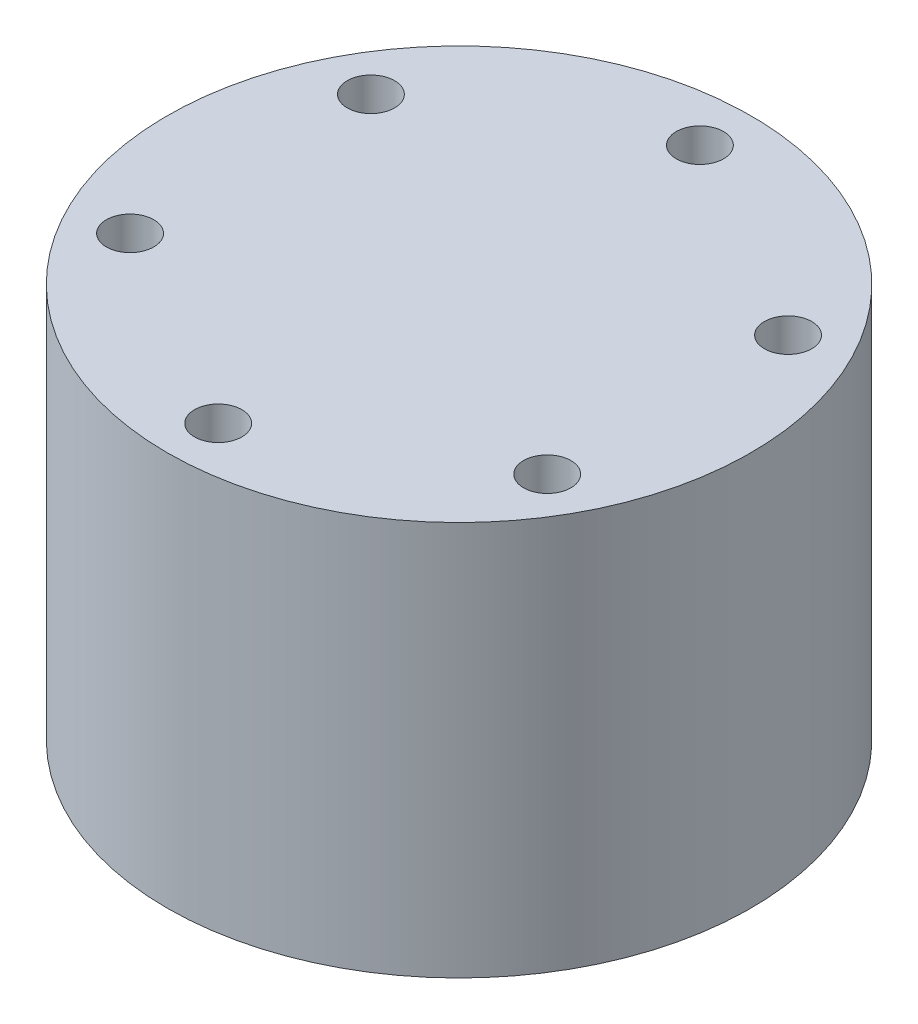
ISO-10303-21;
HEADER;
FILE_DESCRIPTION(('STEP AP214'),'2;1');
FILE_NAME('part.step','',(''),(''),'','','');
FILE_SCHEMA(('AUTOMOTIVE_DESIGN { 1 0 10303 214 1 1 1 1 }'));
ENDSEC;
DATA;
#1=APPLICATION_CONTEXT('core data for automotive mechanical design processes');
#2=APPLICATION_PROTOCOL_DEFINITION('international standard','automotive_design',2000,#1);
#3=PRODUCT_CONTEXT('',#1,'mechanical');
#4=PRODUCT('Part','Part','',(#3));
#5=PRODUCT_RELATED_PRODUCT_CATEGORY('part','',(#4));
#6=PRODUCT_DEFINITION_FORMATION('','',#4);
#7=PRODUCT_DEFINITION_CONTEXT('part definition',#1,'design');
#8=PRODUCT_DEFINITION('design','',#6,#7);
#9=PRODUCT_DEFINITION_SHAPE('','',#8);
#10=(LENGTH_UNIT() NAMED_UNIT(*) SI_UNIT(.MILLI.,.METRE.));
#11=(NAMED_UNIT(*) PLANE_ANGLE_UNIT() SI_UNIT($,.RADIAN.));
#12=(NAMED_UNIT(*) SI_UNIT($,.STERADIAN.) SOLID_ANGLE_UNIT());
#13=UNCERTAINTY_MEASURE_WITH_UNIT(LENGTH_MEASURE(1.E-05),#10,'distance_accuracy_value','');
#14=(GEOMETRIC_REPRESENTATION_CONTEXT(3) GLOBAL_UNCERTAINTY_ASSIGNED_CONTEXT((#13)) GLOBAL_UNIT_ASSIGNED_CONTEXT((#10,
#11,#12)) REPRESENTATION_CONTEXT('',''));
#15=CARTESIAN_POINT('',(0.,0.,0.));
#16=DIRECTION('',(0.,0.,1.));
#17=DIRECTION('',(1.,0.,0.));
#18=AXIS2_PLACEMENT_3D('',#15,#16,#17);
#19=CARTESIAN_POINT('',(0.,25.,0.));
#20=DIRECTION('',(0.,-1.,0.));
#21=DIRECTION('',(0.,0.,-1.));
#22=AXIS2_PLACEMENT_3D('',#19,#20,#21);
#23=CYLINDRICAL_SURFACE('',#22,18.5);
#24=CARTESIAN_POINT('',(0.,25.,0.));
#25=DIRECTION('',(0.,1.,0.));
#26=DIRECTION('',(0.,0.,1.));
#27=AXIS2_PLACEMENT_3D('',#24,#25,#26);
#28=CIRCLE('',#27,18.5);
#29=CARTESIAN_POINT('',(0.,25.,18.5));
#30=VERTEX_POINT('',#29);
#31=EDGE_CURVE('E10',#30,#30,#28,.T.);
#32=ORIENTED_EDGE('',*,*,#31,.F.);
#33=EDGE_LOOP('',(#32));
#34=FACE_BOUND('',#33,.T.);
#35=CARTESIAN_POINT('',(0.,0.,0.));
#36=DIRECTION('',(0.,1.,0.));
#37=DIRECTION('',(0.,0.,1.));
#38=AXIS2_PLACEMENT_3D('',#35,#36,#37);
#39=CIRCLE('',#38,18.5);
#40=CARTESIAN_POINT('',(0.,0.,18.5));
#41=VERTEX_POINT('',#40);
#42=EDGE_CURVE('E46',#41,#41,#39,.T.);
#43=ORIENTED_EDGE('',*,*,#42,.T.);
#44=EDGE_LOOP('',(#43));
#45=FACE_BOUND('',#44,.T.);
#46=ADVANCED_FACE('F43',(#34,#45),#23,.T.);
#47=CARTESIAN_POINT('',(0.,25.,0.));
#48=DIRECTION('',(0.,1.,0.));
#49=DIRECTION('',(0.,0.,1.));
#50=AXIS2_PLACEMENT_3D('',#47,#48,#49);
#51=PLANE('',#50);
#52=CARTESIAN_POINT('',(-13.2198777887695,25.,7.63250000000001));
#53=DIRECTION('',(0.,1.,0.));
#54=DIRECTION('',(0.,0.,1.));
#55=AXIS2_PLACEMENT_3D('',#52,#53,#54);
#56=CIRCLE('',#55,1.5);
#57=CARTESIAN_POINT('',(-13.2198777887695,25.,9.13250000000001));
#58=VERTEX_POINT('',#57);
#59=EDGE_CURVE('E62',#58,#58,#56,.T.);
#60=ORIENTED_EDGE('',*,*,#59,.F.);
#61=EDGE_LOOP('',(#60));
#62=FACE_BOUND('',#61,.T.);
#63=CARTESIAN_POINT('',(0.,25.,15.265));
#64=DIRECTION('',(0.,1.,0.));
#65=DIRECTION('',(0.,0.,1.));
#66=AXIS2_PLACEMENT_3D('',#63,#64,#65);
#67=CIRCLE('',#66,1.5);
#68=CARTESIAN_POINT('',(0.,25.,16.765));
#69=VERTEX_POINT('',#68);
#70=EDGE_CURVE('E70',#69,#69,#67,.T.);
#71=ORIENTED_EDGE('',*,*,#70,.F.);
#72=EDGE_LOOP('',(#71));
#73=FACE_BOUND('',#72,.T.);
#74=CARTESIAN_POINT('',(13.2198777887695,25.,7.6325));
#75=DIRECTION('',(0.,1.,0.));
#76=DIRECTION('',(0.,0.,1.));
#77=AXIS2_PLACEMENT_3D('',#74,#75,#76);
#78=CIRCLE('',#77,1.5);
#79=CARTESIAN_POINT('',(13.2198777887695,25.,9.1325));
#80=VERTEX_POINT('',#79);
#81=EDGE_CURVE('E71',#80,#80,#78,.T.);
#82=ORIENTED_EDGE('',*,*,#81,.F.);
#83=EDGE_LOOP('',(#82));
#84=FACE_BOUND('',#83,.T.);
#85=CARTESIAN_POINT('',(13.2198777887695,25.,-7.6325));
#86=DIRECTION('',(0.,1.,0.));
#87=DIRECTION('',(0.,0.,1.));
#88=AXIS2_PLACEMENT_3D('',#85,#86,#87);
#89=CIRCLE('',#88,1.5);
#90=CARTESIAN_POINT('',(13.2198777887695,25.,-6.1325));
#91=VERTEX_POINT('',#90);
#92=EDGE_CURVE('E76',#91,#91,#89,.T.);
#93=ORIENTED_EDGE('',*,*,#92,.F.);
#94=EDGE_LOOP('',(#93));
#95=FACE_BOUND('',#94,.T.);
#96=CARTESIAN_POINT('',(0.,25.,-15.265));
#97=DIRECTION('',(0.,1.,0.));
#98=DIRECTION('',(0.,0.,1.));
#99=AXIS2_PLACEMENT_3D('',#96,#97,#98);
#100=CIRCLE('',#99,1.5);
#101=CARTESIAN_POINT('',(0.,25.,-13.765));
#102=VERTEX_POINT('',#101);
#103=EDGE_CURVE('E84',#102,#102,#100,.T.);
#104=ORIENTED_EDGE('',*,*,#103,.F.);
#105=EDGE_LOOP('',(#104));
#106=FACE_BOUND('',#105,.T.);
#107=CARTESIAN_POINT('',(-13.2198777887695,25.,-7.6325));
#108=DIRECTION('',(0.,1.,0.));
#109=DIRECTION('',(0.,0.,1.));
#110=AXIS2_PLACEMENT_3D('',#107,#108,#109);
#111=CIRCLE('',#110,1.5);
#112=CARTESIAN_POINT('',(-13.2198777887695,25.,-6.1325));
#113=VERTEX_POINT('',#112);
#114=EDGE_CURVE('E54',#113,#113,#111,.T.);
#115=ORIENTED_EDGE('',*,*,#114,.F.);
#116=EDGE_LOOP('',(#115));
#117=FACE_BOUND('',#116,.T.);
#118=ORIENTED_EDGE('',*,*,#31,.T.);
#119=EDGE_LOOP('',(#118));
#120=FACE_BOUND('',#119,.T.);
#121=ADVANCED_FACE('F99',(#62,#73,#84,#95,#106,#117,#120),#51,.T.);
#122=CARTESIAN_POINT('',(0.,0.,0.));
#123=DIRECTION('',(0.,1.,0.));
#124=DIRECTION('',(0.,0.,1.));
#125=AXIS2_PLACEMENT_3D('',#122,#123,#124);
#126=PLANE('',#125);
#127=ORIENTED_EDGE('',*,*,#42,.F.);
#128=EDGE_LOOP('',(#127));
#129=FACE_BOUND('',#128,.T.);
#130=ADVANCED_FACE('F103',(#129),#126,.F.);
#131=CARTESIAN_POINT('',(-13.2198777887695,15.,-7.6325));
#132=DIRECTION('',(0.,1.,0.));
#133=DIRECTION('',(0.,0.,1.));
#134=AXIS2_PLACEMENT_3D('',#131,#132,#133);
#135=CYLINDRICAL_SURFACE('',#134,1.5);
#136=CARTESIAN_POINT('',(-13.2198777887695,15.,-7.6325));
#137=DIRECTION('',(0.,1.,0.));
#138=DIRECTION('',(0.,0.,1.));
#139=AXIS2_PLACEMENT_3D('',#136,#137,#138);
#140=CIRCLE('',#139,1.5);
#141=CARTESIAN_POINT('',(-13.2198777887695,15.,-6.1325));
#142=VERTEX_POINT('',#141);
#143=EDGE_CURVE('E52',#142,#142,#140,.T.);
#144=ORIENTED_EDGE('',*,*,#143,.F.);
#145=EDGE_LOOP('',(#144));
#146=FACE_BOUND('',#145,.T.);
#147=ORIENTED_EDGE('',*,*,#114,.T.);
#148=EDGE_LOOP('',(#147));
#149=FACE_BOUND('',#148,.T.);
#150=ADVANCED_FACE('F107',(#146,#149),#135,.F.);
#151=CARTESIAN_POINT('',(0.,15.,0.));
#152=DIRECTION('',(0.,1.,0.));
#153=DIRECTION('',(0.,0.,1.));
#154=AXIS2_PLACEMENT_3D('',#151,#152,#153);
#155=PLANE('',#154);
#156=ORIENTED_EDGE('',*,*,#143,.T.);
#157=EDGE_LOOP('',(#156));
#158=FACE_BOUND('',#157,.T.);
#159=ADVANCED_FACE('F96',(#158),#155,.T.);
#160=CARTESIAN_POINT('',(0.,15.,-15.265));
#161=DIRECTION('',(0.,1.,0.));
#162=DIRECTION('',(0.,0.,1.));
#163=AXIS2_PLACEMENT_3D('',#160,#161,#162);
#164=CYLINDRICAL_SURFACE('',#163,1.5);
#165=CARTESIAN_POINT('',(0.,15.,-15.265));
#166=DIRECTION('',(0.,1.,0.));
#167=DIRECTION('',(0.,0.,1.));
#168=AXIS2_PLACEMENT_3D('',#165,#166,#167);
#169=CIRCLE('',#168,1.5);
#170=CARTESIAN_POINT('',(0.,15.,-13.765));
#171=VERTEX_POINT('',#170);
#172=EDGE_CURVE('E59',#171,#171,#169,.T.);
#173=ORIENTED_EDGE('',*,*,#172,.F.);
#174=EDGE_LOOP('',(#173));
#175=FACE_BOUND('',#174,.T.);
#176=ORIENTED_EDGE('',*,*,#103,.T.);
#177=EDGE_LOOP('',(#176));
#178=FACE_BOUND('',#177,.T.);
#179=ADVANCED_FACE('F91',(#175,#178),#164,.F.);
#180=CARTESIAN_POINT('',(0.,15.,0.));
#181=DIRECTION('',(0.,1.,0.));
#182=DIRECTION('',(0.,0.,1.));
#183=AXIS2_PLACEMENT_3D('',#180,#181,#182);
#184=PLANE('',#183);
#185=ORIENTED_EDGE('',*,*,#172,.T.);
#186=EDGE_LOOP('',(#185));
#187=FACE_BOUND('',#186,.T.);
#188=ADVANCED_FACE('F93',(#187),#184,.T.);
#189=CARTESIAN_POINT('',(13.2198777887695,15.,-7.6325));
#190=DIRECTION('',(0.,1.,0.));
#191=DIRECTION('',(0.,0.,1.));
#192=AXIS2_PLACEMENT_3D('',#189,#190,#191);
#193=CYLINDRICAL_SURFACE('',#192,1.5);
#194=CARTESIAN_POINT('',(13.2198777887695,15.,-7.6325));
#195=DIRECTION('',(0.,1.,0.));
#196=DIRECTION('',(0.,0.,1.));
#197=AXIS2_PLACEMENT_3D('',#194,#195,#196);
#198=CIRCLE('',#197,1.5);
#199=CARTESIAN_POINT('',(13.2198777887695,15.,-6.1325));
#200=VERTEX_POINT('',#199);
#201=EDGE_CURVE('E85',#200,#200,#198,.T.);
#202=ORIENTED_EDGE('',*,*,#201,.F.);
#203=EDGE_LOOP('',(#202));
#204=FACE_BOUND('',#203,.T.);
#205=ORIENTED_EDGE('',*,*,#92,.T.);
#206=EDGE_LOOP('',(#205));
#207=FACE_BOUND('',#206,.T.);
#208=ADVANCED_FACE('F165',(#204,#207),#193,.F.);
#209=CARTESIAN_POINT('',(0.,15.,0.));
#210=DIRECTION('',(0.,1.,0.));
#211=DIRECTION('',(0.,0.,1.));
#212=AXIS2_PLACEMENT_3D('',#209,#210,#211);
#213=PLANE('',#212);
#214=ORIENTED_EDGE('',*,*,#201,.T.);
#215=EDGE_LOOP('',(#214));
#216=FACE_BOUND('',#215,.T.);
#217=ADVANCED_FACE('F172',(#216),#213,.T.);
#218=CARTESIAN_POINT('',(13.2198777887695,15.,7.6325));
#219=DIRECTION('',(0.,1.,0.));
#220=DIRECTION('',(0.,0.,1.));
#221=AXIS2_PLACEMENT_3D('',#218,#219,#220);
#222=CYLINDRICAL_SURFACE('',#221,1.5);
#223=CARTESIAN_POINT('',(13.2198777887695,15.,7.6325));
#224=DIRECTION('',(0.,1.,0.));
#225=DIRECTION('',(0.,0.,1.));
#226=AXIS2_PLACEMENT_3D('',#223,#224,#225);
#227=CIRCLE('',#226,1.5);
#228=CARTESIAN_POINT('',(13.2198777887695,15.,9.1325));
#229=VERTEX_POINT('',#228);
#230=EDGE_CURVE('E77',#229,#229,#227,.T.);
#231=ORIENTED_EDGE('',*,*,#230,.F.);
#232=EDGE_LOOP('',(#231));
#233=FACE_BOUND('',#232,.T.);
#234=ORIENTED_EDGE('',*,*,#81,.T.);
#235=EDGE_LOOP('',(#234));
#236=FACE_BOUND('',#235,.T.);
#237=ADVANCED_FACE('F179',(#233,#236),#222,.F.);
#238=CARTESIAN_POINT('',(0.,15.,0.));
#239=DIRECTION('',(0.,1.,0.));
#240=DIRECTION('',(0.,0.,1.));
#241=AXIS2_PLACEMENT_3D('',#238,#239,#240);
#242=PLANE('',#241);
#243=ORIENTED_EDGE('',*,*,#230,.T.);
#244=EDGE_LOOP('',(#243));
#245=FACE_BOUND('',#244,.T.);
#246=ADVANCED_FACE('F188',(#245),#242,.T.);
#247=CARTESIAN_POINT('',(0.,15.,15.265));
#248=DIRECTION('',(0.,1.,0.));
#249=DIRECTION('',(0.,0.,1.));
#250=AXIS2_PLACEMENT_3D('',#247,#248,#249);
#251=CYLINDRICAL_SURFACE('',#250,1.5);
#252=CARTESIAN_POINT('',(0.,15.,15.265));
#253=DIRECTION('',(0.,1.,0.));
#254=DIRECTION('',(0.,0.,1.));
#255=AXIS2_PLACEMENT_3D('',#252,#253,#254);
#256=CIRCLE('',#255,1.5);
#257=CARTESIAN_POINT('',(0.,15.,16.765));
#258=VERTEX_POINT('',#257);
#259=EDGE_CURVE('E69',#258,#258,#256,.T.);
#260=ORIENTED_EDGE('',*,*,#259,.F.);
#261=EDGE_LOOP('',(#260));
#262=FACE_BOUND('',#261,.T.);
#263=ORIENTED_EDGE('',*,*,#70,.T.);
#264=EDGE_LOOP('',(#263));
#265=FACE_BOUND('',#264,.T.);
#266=ADVANCED_FACE('F200',(#262,#265),#251,.F.);
#267=CARTESIAN_POINT('',(0.,15.,0.));
#268=DIRECTION('',(0.,1.,0.));
#269=DIRECTION('',(0.,0.,1.));
#270=AXIS2_PLACEMENT_3D('',#267,#268,#269);
#271=PLANE('',#270);
#272=ORIENTED_EDGE('',*,*,#259,.T.);
#273=EDGE_LOOP('',(#272));
#274=FACE_BOUND('',#273,.T.);
#275=ADVANCED_FACE('F207',(#274),#271,.T.);
#276=CARTESIAN_POINT('',(-13.2198777887695,15.,7.63250000000001));
#277=DIRECTION('',(0.,1.,0.));
#278=DIRECTION('',(0.,0.,1.));
#279=AXIS2_PLACEMENT_3D('',#276,#277,#278);
#280=CYLINDRICAL_SURFACE('',#279,1.5);
#281=CARTESIAN_POINT('',(-13.2198777887695,15.,7.63250000000001));
#282=DIRECTION('',(0.,1.,0.));
#283=DIRECTION('',(0.,0.,1.));
#284=AXIS2_PLACEMENT_3D('',#281,#282,#283);
#285=CIRCLE('',#284,1.5);
#286=CARTESIAN_POINT('',(-13.2198777887695,15.,9.13250000000001));
#287=VERTEX_POINT('',#286);
#288=EDGE_CURVE('E61',#287,#287,#285,.T.);
#289=ORIENTED_EDGE('',*,*,#288,.F.);
#290=EDGE_LOOP('',(#289));
#291=FACE_BOUND('',#290,.T.);
#292=ORIENTED_EDGE('',*,*,#59,.T.);
#293=EDGE_LOOP('',(#292));
#294=FACE_BOUND('',#293,.T.);
#295=ADVANCED_FACE('F217',(#291,#294),#280,.F.);
#296=CARTESIAN_POINT('',(0.,15.,0.));
#297=DIRECTION('',(0.,1.,0.));
#298=DIRECTION('',(0.,0.,1.));
#299=AXIS2_PLACEMENT_3D('',#296,#297,#298);
#300=PLANE('',#299);
#301=ORIENTED_EDGE('',*,*,#288,.T.);
#302=EDGE_LOOP('',(#301));
#303=FACE_BOUND('',#302,.T.);
#304=ADVANCED_FACE('F229',(#303),#300,.T.);
#305=CLOSED_SHELL('',(#46,#121,#130,#150,#159,#179,#188,#208,#217,#237,#246,#266,#275,#295,#304));
#306=MANIFOLD_SOLID_BREP('B2',#305);
#307=ADVANCED_BREP_SHAPE_REPRESENTATION('',(#18,#306),#14);
#308=SHAPE_DEFINITION_REPRESENTATION(#9,#307);
ENDSEC;
END-ISO-10303-21;
